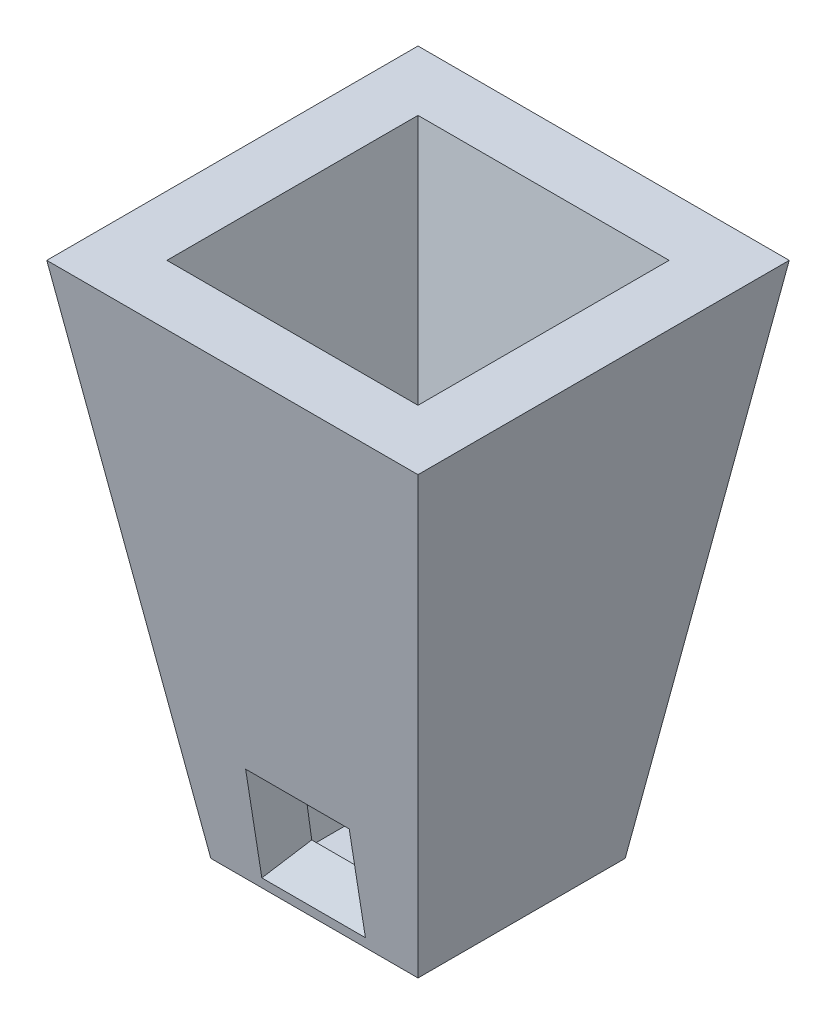
ISO-10303-21;
HEADER;
FILE_DESCRIPTION(('STEP AP214'),'2;1');
FILE_NAME('part.step','',(''),(''),'','','');
FILE_SCHEMA(('AUTOMOTIVE_DESIGN { 1 0 10303 214 1 1 1 1 }'));
ENDSEC;
DATA;
#1=APPLICATION_CONTEXT('core data for automotive mechanical design processes');
#2=APPLICATION_PROTOCOL_DEFINITION('international standard','automotive_design',2000,#1);
#3=PRODUCT_CONTEXT('',#1,'mechanical');
#4=PRODUCT('Part','Part','',(#3));
#5=PRODUCT_RELATED_PRODUCT_CATEGORY('part','',(#4));
#6=PRODUCT_DEFINITION_FORMATION('','',#4);
#7=PRODUCT_DEFINITION_CONTEXT('part definition',#1,'design');
#8=PRODUCT_DEFINITION('design','',#6,#7);
#9=PRODUCT_DEFINITION_SHAPE('','',#8);
#10=(LENGTH_UNIT() NAMED_UNIT(*) SI_UNIT(.MILLI.,.METRE.));
#11=(NAMED_UNIT(*) PLANE_ANGLE_UNIT() SI_UNIT($,.RADIAN.));
#12=(NAMED_UNIT(*) SI_UNIT($,.STERADIAN.) SOLID_ANGLE_UNIT());
#13=UNCERTAINTY_MEASURE_WITH_UNIT(LENGTH_MEASURE(1.E-05),#10,'distance_accuracy_value','');
#14=(GEOMETRIC_REPRESENTATION_CONTEXT(3) GLOBAL_UNCERTAINTY_ASSIGNED_CONTEXT((#13)) GLOBAL_UNIT_ASSIGNED_CONTEXT((#10,
#11,#12)) REPRESENTATION_CONTEXT('',''));
#15=CARTESIAN_POINT('',(0.,0.,0.));
#16=DIRECTION('',(0.,0.,1.));
#17=DIRECTION('',(1.,0.,0.));
#18=AXIS2_PLACEMENT_3D('',#15,#16,#17);
#19=CARTESIAN_POINT('',(-43.5142255154078,0.,-7.62404381991147));
#20=DIRECTION('',(0.,-0.156434465040231,-0.987688340595138));
#21=DIRECTION('',(0.,0.987688340595138,-0.156434465040231));
#22=AXIS2_PLACEMENT_3D('',#19,#20,#21);
#23=PLANE('',#22);
#24=DIRECTION('',(1.,0.,0.));
#25=VECTOR('',#24,1.);
#26=CARTESIAN_POINT('',(-43.5142255154078,0.,-7.62404381991147));
#27=LINE('',#26,#25);
#28=CARTESIAN_POINT('',(-43.5142255154078,0.,-7.62404381991147));
#29=VERTEX_POINT('',#28);
#30=CARTESIAN_POINT('',(7.28577448459214,0.,-7.62404381991147));
#31=VERTEX_POINT('',#30);
#32=EDGE_CURVE('E284',#29,#31,#27,.T.);
#33=ORIENTED_EDGE('',*,*,#32,.F.);
#34=DIRECTION('',(-0.154554782932108,0.975820494837866,-0.154554782932108));
#35=VECTOR('',#34,1.);
#36=CARTESIAN_POINT('',(-43.5142255154078,0.,-7.62404381991147));
#37=LINE('',#36,#35);
#38=CARTESIAN_POINT('',(-63.629049436624,127.,-27.7388677411276));
#39=VERTEX_POINT('',#38);
#40=EDGE_CURVE('E296',#39,#29,#37,.F.);
#41=ORIENTED_EDGE('',*,*,#40,.F.);
#42=DIRECTION('',(1.,0.,0.));
#43=VECTOR('',#42,1.);
#44=CARTESIAN_POINT('',(0.,127.,-27.7388677411276));
#45=LINE('',#44,#43);
#46=CARTESIAN_POINT('',(27.4005984058082,127.,-27.7388677411276));
#47=VERTEX_POINT('',#46);
#48=EDGE_CURVE('E306',#39,#47,#45,.T.);
#49=ORIENTED_EDGE('',*,*,#48,.T.);
#50=DIRECTION('',(-0.154554782932108,-0.975820494837866,0.154554782932108));
#51=VECTOR('',#50,1.);
#52=CARTESIAN_POINT('',(6.07230569349084,-7.6615404178267,-6.41057502881017));
#53=LINE('',#52,#51);
#54=EDGE_CURVE('E49',#47,#31,#53,.T.);
#55=ORIENTED_EDGE('',*,*,#54,.T.);
#56=EDGE_LOOP('',(#33,#41,#49,#55));
#57=FACE_BOUND('',#56,.T.);
#58=DIRECTION('',(-1.,0.,0.));
#59=VECTOR('',#58,1.);
#60=CARTESIAN_POINT('',(-5.61940159419177,27.5960122362282,-11.9948227731355));
#61=LINE('',#60,#59);
#62=CARTESIAN_POINT('',(-5.61940159419177,27.5960122362282,-11.9948227731355));
#63=VERTEX_POINT('',#62);
#64=CARTESIAN_POINT('',(-31.0194015941918,27.5960122362282,-11.9948227731355));
#65=VERTEX_POINT('',#64);
#66=EDGE_CURVE('E173',#63,#65,#61,.T.);
#67=ORIENTED_EDGE('',*,*,#66,.T.);
#68=DIRECTION('',(0.,-0.987688340595138,0.156434465040231));
#69=VECTOR('',#68,1.);
#70=CARTESIAN_POINT('',(-31.0194015941918,27.5960122362282,-11.9948227731355));
#71=LINE('',#70,#69);
#72=CARTESIAN_POINT('',(-31.0194015941918,2.50872838511165,-8.02138736111366));
#73=VERTEX_POINT('',#72);
#74=EDGE_CURVE('E156',#65,#73,#71,.T.);
#75=ORIENTED_EDGE('',*,*,#74,.T.);
#76=DIRECTION('',(-1.,0.,0.));
#77=VECTOR('',#76,1.);
#78=CARTESIAN_POINT('',(-5.61940159419177,2.50872838511165,-8.02138736111366));
#79=LINE('',#78,#77);
#80=CARTESIAN_POINT('',(-5.61940159419177,2.50872838511165,-8.02138736111366));
#81=VERTEX_POINT('',#80);
#82=EDGE_CURVE('E165',#81,#73,#79,.T.);
#83=ORIENTED_EDGE('',*,*,#82,.F.);
#84=DIRECTION('',(0.,-0.987688340595138,0.156434465040231));
#85=VECTOR('',#84,1.);
#86=CARTESIAN_POINT('',(-5.61940159419177,27.5960122362282,-11.9948227731355));
#87=LINE('',#86,#85);
#88=EDGE_CURVE('E57',#63,#81,#87,.T.);
#89=ORIENTED_EDGE('',*,*,#88,.F.);
#90=EDGE_LOOP('',(#67,#75,#83,#89));
#91=FACE_BOUND('',#90,.T.);
#92=ADVANCED_FACE('F39',(#57,#91),#23,.T.);
#93=CARTESIAN_POINT('',(-48.897049436624,127.,-13.0068677411276));
#94=DIRECTION('',(0.,-0.139173100960065,-0.99026806874157));
#95=DIRECTION('',(0.,0.99026806874157,-0.139173100960065));
#96=AXIS2_PLACEMENT_3D('',#93,#94,#95);
#97=PLANE('',#96);
#98=DIRECTION('',(1.,0.,0.));
#99=VECTOR('',#98,1.);
#100=CARTESIAN_POINT('',(-48.897049436624,127.,-13.0068677411276));
#101=LINE('',#100,#99);
#102=CARTESIAN_POINT('',(-48.897049436624,127.,-13.0068677411276));
#103=VERTEX_POINT('',#102);
#104=CARTESIAN_POINT('',(12.6685984058082,127.,-13.0068677411276));
#105=VERTEX_POINT('',#104);
#106=EDGE_CURVE('E241',#103,#105,#101,.T.);
#107=ORIENTED_EDGE('',*,*,#106,.F.);
#108=DIRECTION('',(0.137844537491629,-0.980814848463989,0.137844537491629));
#109=VECTOR('',#108,1.);
#110=CARTESIAN_POINT('',(-48.897049436624,127.,-13.0068677411276));
#111=LINE('',#110,#109);
#112=CARTESIAN_POINT('',(-31.4053371495643,2.54,4.48484454593206));
#113=VERTEX_POINT('',#112);
#114=EDGE_CURVE('E254',#113,#103,#111,.F.);
#115=ORIENTED_EDGE('',*,*,#114,.F.);
#116=DIRECTION('',(-1.,0.,0.));
#117=VECTOR('',#116,1.);
#118=CARTESIAN_POINT('',(-48.897049436624,2.53999999999999,4.48484454593206));
#119=LINE('',#118,#117);
#120=CARTESIAN_POINT('',(-4.82311388125139,2.54,4.48484454593206));
#121=VERTEX_POINT('',#120);
#122=EDGE_CURVE('E272',#113,#121,#119,.F.);
#123=ORIENTED_EDGE('',*,*,#122,.T.);
#124=DIRECTION('',(0.137844537491629,0.980814848463989,-0.137844537491629));
#125=VECTOR('',#124,1.);
#126=CARTESIAN_POINT('',(12.6685984058082,127.,-13.0068677411276));
#127=LINE('',#126,#125);
#128=EDGE_CURVE('E259',#121,#105,#127,.T.);
#129=ORIENTED_EDGE('',*,*,#128,.T.);
#130=EDGE_LOOP('',(#107,#115,#123,#129));
#131=FACE_BOUND('',#130,.T.);
#132=DIRECTION('',(1.,0.,0.));
#133=VECTOR('',#132,1.);
#134=CARTESIAN_POINT('',(-5.61940159419177,4.44707052530171,4.21682326246982));
#135=LINE('',#134,#133);
#136=CARTESIAN_POINT('',(-5.61940159419177,4.44707052530171,4.21682326246984));
#137=VERTEX_POINT('',#136);
#138=CARTESIAN_POINT('',(-31.0194015941918,4.4470705253017,4.21682326246983));
#139=VERTEX_POINT('',#138);
#140=EDGE_CURVE('E170',#137,#139,#135,.F.);
#141=ORIENTED_EDGE('',*,*,#140,.T.);
#142=DIRECTION('',(0.,0.99026806874157,-0.139173100960065));
#143=VECTOR('',#142,1.);
#144=CARTESIAN_POINT('',(-31.0194015941918,30.9357806710319,0.494077828399206));
#145=LINE('',#144,#143);
#146=CARTESIAN_POINT('',(-31.0194015941918,29.6037109495231,0.681288018941843));
#147=VERTEX_POINT('',#146);
#148=EDGE_CURVE('E65',#147,#139,#145,.F.);
#149=ORIENTED_EDGE('',*,*,#148,.F.);
#150=DIRECTION('',(1.,0.,0.));
#151=VECTOR('',#150,1.);
#152=CARTESIAN_POINT('',(-5.61940159419177,29.6037109495231,0.681288018941836));
#153=LINE('',#152,#151);
#154=CARTESIAN_POINT('',(-5.61940159419177,29.6037109495231,0.681288018941809));
#155=VERTEX_POINT('',#154);
#156=EDGE_CURVE('E425',#155,#147,#153,.F.);
#157=ORIENTED_EDGE('',*,*,#156,.F.);
#158=DIRECTION('',(0.,0.99026806874157,-0.139173100960065));
#159=VECTOR('',#158,1.);
#160=CARTESIAN_POINT('',(-5.61940159419177,30.9357806710319,0.494077828399206));
#161=LINE('',#160,#159);
#162=EDGE_CURVE('E422',#155,#137,#161,.F.);
#163=ORIENTED_EDGE('',*,*,#162,.T.);
#164=EDGE_LOOP('',(#141,#149,#157,#163));
#165=FACE_BOUND('',#164,.T.);
#166=ADVANCED_FACE('F344',(#131,#165),#97,.F.);
#167=CARTESIAN_POINT('',(-43.5142255154078,0.,43.1759561800885));
#168=DIRECTION('',(0.,-0.156434465040231,0.987688340595138));
#169=DIRECTION('',(0.,-0.987688340595138,-0.156434465040231));
#170=AXIS2_PLACEMENT_3D('',#167,#168,#169);
#171=PLANE('',#170);
#172=DIRECTION('',(1.,0.,0.));
#173=VECTOR('',#172,1.);
#174=CARTESIAN_POINT('',(-30.6090494366239,2.50872838511165,43.5732997212907));
#175=LINE('',#174,#173);
#176=CARTESIAN_POINT('',(-30.6090494366239,2.50872838511165,43.5732997212907));
#177=VERTEX_POINT('',#176);
#178=CARTESIAN_POINT('',(-5.20904943662394,2.50872838511165,43.5732997212907));
#179=VERTEX_POINT('',#178);
#180=EDGE_CURVE('E205',#177,#179,#175,.T.);
#181=ORIENTED_EDGE('',*,*,#180,.F.);
#182=DIRECTION('',(0.,-0.987688340595138,-0.156434465040231));
#183=VECTOR('',#182,1.);
#184=CARTESIAN_POINT('',(-30.6090494366239,27.5960122362282,47.5467351333126));
#185=LINE('',#184,#183);
#186=CARTESIAN_POINT('',(-30.6090494366239,27.5960122362282,47.5467351333126));
#187=VERTEX_POINT('',#186);
#188=EDGE_CURVE('E202',#187,#177,#185,.T.);
#189=ORIENTED_EDGE('',*,*,#188,.F.);
#190=DIRECTION('',(-1.,0.,0.));
#191=VECTOR('',#190,1.);
#192=CARTESIAN_POINT('',(-30.6090494366239,27.5960122362282,47.5467351333126));
#193=LINE('',#192,#191);
#194=CARTESIAN_POINT('',(-5.20904943662394,27.5960122362281,47.5467351333126));
#195=VERTEX_POINT('',#194);
#196=EDGE_CURVE('E213',#195,#187,#193,.T.);
#197=ORIENTED_EDGE('',*,*,#196,.F.);
#198=DIRECTION('',(0.,0.987688340595138,0.156434465040231));
#199=VECTOR('',#198,1.);
#200=CARTESIAN_POINT('',(-5.20904943662394,27.5960122362281,47.5467351333126));
#201=LINE('',#200,#199);
#202=EDGE_CURVE('E209',#179,#195,#201,.T.);
#203=ORIENTED_EDGE('',*,*,#202,.F.);
#204=EDGE_LOOP('',(#181,#189,#197,#203));
#205=FACE_BOUND('',#204,.T.);
#206=DIRECTION('',(1.,0.,0.));
#207=VECTOR('',#206,1.);
#208=CARTESIAN_POINT('',(-43.5142255154078,0.,43.1759561800885));
#209=LINE('',#208,#207);
#210=CARTESIAN_POINT('',(-43.5142255154078,0.,43.1759561800885));
#211=VERTEX_POINT('',#210);
#212=CARTESIAN_POINT('',(7.28577448459215,0.,43.1759561800885));
#213=VERTEX_POINT('',#212);
#214=EDGE_CURVE('E253',#211,#213,#209,.T.);
#215=ORIENTED_EDGE('',*,*,#214,.T.);
#216=DIRECTION('',(0.154554782932108,0.975820494837866,0.154554782932108));
#217=VECTOR('',#216,1.);
#218=CARTESIAN_POINT('',(6.07230569349086,-7.66154041782671,41.9624873889872));
#219=LINE('',#218,#217);
#220=CARTESIAN_POINT('',(27.4005984058083,127.,63.2907801013046));
#221=VERTEX_POINT('',#220);
#222=EDGE_CURVE('E11',#221,#213,#219,.F.);
#223=ORIENTED_EDGE('',*,*,#222,.F.);
#224=DIRECTION('',(-1.,0.,0.));
#225=VECTOR('',#224,1.);
#226=CARTESIAN_POINT('',(0.,127.,63.2907801013046));
#227=LINE('',#226,#225);
#228=CARTESIAN_POINT('',(-63.629049436624,127.,63.2907801013046));
#229=VERTEX_POINT('',#228);
#230=EDGE_CURVE('E290',#229,#221,#227,.F.);
#231=ORIENTED_EDGE('',*,*,#230,.F.);
#232=DIRECTION('',(0.154554782932108,-0.975820494837866,-0.154554782932108));
#233=VECTOR('',#232,1.);
#234=CARTESIAN_POINT('',(-43.5142255154078,0.,43.1759561800885));
#235=LINE('',#234,#233);
#236=EDGE_CURVE('E292',#229,#211,#235,.T.);
#237=ORIENTED_EDGE('',*,*,#236,.T.);
#238=EDGE_LOOP('',(#215,#223,#231,#237));
#239=FACE_BOUND('',#238,.T.);
#240=ADVANCED_FACE('F324',(#205,#239),#171,.T.);
#241=CARTESIAN_POINT('',(7.28577448459214,0.,-7.62404381991147));
#242=DIRECTION('',(0.987688340595138,-0.156434465040231,0.));
#243=DIRECTION('',(0.156434465040231,0.987688340595138,0.));
#244=AXIS2_PLACEMENT_3D('',#241,#242,#243);
#245=PLANE('',#244);
#246=DIRECTION('',(0.,0.,1.));
#247=VECTOR('',#246,1.);
#248=CARTESIAN_POINT('',(7.28577448459214,0.,-7.62404381991147));
#249=LINE('',#248,#247);
#250=EDGE_CURVE('E280',#31,#213,#249,.T.);
#251=ORIENTED_EDGE('',*,*,#250,.F.);
#252=ORIENTED_EDGE('',*,*,#54,.F.);
#253=DIRECTION('',(0.,0.,1.));
#254=VECTOR('',#253,1.);
#255=CARTESIAN_POINT('',(27.4005984058083,127.,0.));
#256=LINE('',#255,#254);
#257=EDGE_CURVE('E303',#47,#221,#256,.T.);
#258=ORIENTED_EDGE('',*,*,#257,.T.);
#259=ORIENTED_EDGE('',*,*,#222,.T.);
#260=EDGE_LOOP('',(#251,#252,#258,#259));
#261=FACE_BOUND('',#260,.T.);
#262=ADVANCED_FACE('F41',(#261),#245,.T.);
#263=CARTESIAN_POINT('',(-43.5142255154078,0.,-7.62404381991147));
#264=DIRECTION('',(-0.987688340595138,-0.156434465040231,0.));
#265=DIRECTION('',(0.156434465040231,-0.987688340595138,0.));
#266=AXIS2_PLACEMENT_3D('',#263,#264,#265);
#267=PLANE('',#266);
#268=DIRECTION('',(0.,0.,1.));
#269=VECTOR('',#268,1.);
#270=CARTESIAN_POINT('',(-43.5142255154078,0.,-7.62404381991147));
#271=LINE('',#270,#269);
#272=EDGE_CURVE('E288',#29,#211,#271,.T.);
#273=ORIENTED_EDGE('',*,*,#272,.T.);
#274=ORIENTED_EDGE('',*,*,#236,.F.);
#275=DIRECTION('',(0.,0.,-1.));
#276=VECTOR('',#275,1.);
#277=CARTESIAN_POINT('',(-63.629049436624,127.,0.));
#278=LINE('',#277,#276);
#279=EDGE_CURVE('E43',#39,#229,#278,.F.);
#280=ORIENTED_EDGE('',*,*,#279,.F.);
#281=ORIENTED_EDGE('',*,*,#40,.T.);
#282=EDGE_LOOP('',(#273,#274,#280,#281));
#283=FACE_BOUND('',#282,.T.);
#284=ADVANCED_FACE('F320',(#283),#267,.T.);
#285=CARTESIAN_POINT('',(0.,127.,0.));
#286=DIRECTION('',(0.,-1.,0.));
#287=DIRECTION('',(0.,0.,-1.));
#288=AXIS2_PLACEMENT_3D('',#285,#286,#287);
#289=PLANE('',#288);
#290=DIRECTION('',(0.,0.,1.));
#291=VECTOR('',#290,1.);
#292=CARTESIAN_POINT('',(12.6685984058082,127.,-13.0068677411276));
#293=LINE('',#292,#291);
#294=CARTESIAN_POINT('',(12.6685984058083,127.,48.5587801013046));
#295=VERTEX_POINT('',#294);
#296=EDGE_CURVE('E237',#105,#295,#293,.T.);
#297=ORIENTED_EDGE('',*,*,#296,.T.);
#298=DIRECTION('',(1.,0.,0.));
#299=VECTOR('',#298,1.);
#300=CARTESIAN_POINT('',(-48.897049436624,127.,48.5587801013046));
#301=LINE('',#300,#299);
#302=CARTESIAN_POINT('',(-48.897049436624,127.,48.5587801013046));
#303=VERTEX_POINT('',#302);
#304=EDGE_CURVE('E234',#303,#295,#301,.T.);
#305=ORIENTED_EDGE('',*,*,#304,.F.);
#306=DIRECTION('',(0.,0.,1.));
#307=VECTOR('',#306,1.);
#308=CARTESIAN_POINT('',(-48.897049436624,127.,-13.0068677411276));
#309=LINE('',#308,#307);
#310=EDGE_CURVE('E245',#103,#303,#309,.T.);
#311=ORIENTED_EDGE('',*,*,#310,.F.);
#312=ORIENTED_EDGE('',*,*,#106,.T.);
#313=EDGE_LOOP('',(#297,#305,#311,#312));
#314=FACE_BOUND('',#313,.T.);
#315=ORIENTED_EDGE('',*,*,#230,.T.);
#316=ORIENTED_EDGE('',*,*,#257,.F.);
#317=ORIENTED_EDGE('',*,*,#48,.F.);
#318=ORIENTED_EDGE('',*,*,#279,.T.);
#319=EDGE_LOOP('',(#315,#316,#317,#318));
#320=FACE_BOUND('',#319,.T.);
#321=ADVANCED_FACE('F315',(#314,#320),#289,.F.);
#322=CARTESIAN_POINT('',(0.,0.,0.));
#323=DIRECTION('',(0.,-1.,0.));
#324=DIRECTION('',(0.,0.,-1.));
#325=AXIS2_PLACEMENT_3D('',#322,#323,#324);
#326=PLANE('',#325);
#327=ORIENTED_EDGE('',*,*,#214,.F.);
#328=ORIENTED_EDGE('',*,*,#272,.F.);
#329=ORIENTED_EDGE('',*,*,#32,.T.);
#330=ORIENTED_EDGE('',*,*,#250,.T.);
#331=EDGE_LOOP('',(#327,#328,#329,#330));
#332=FACE_BOUND('',#331,.T.);
#333=ADVANCED_FACE('F329',(#332),#326,.T.);
#334=CARTESIAN_POINT('',(-48.897049436624,127.,48.5587801013046));
#335=DIRECTION('',(0.,-0.139173100960065,0.99026806874157));
#336=DIRECTION('',(0.,-0.99026806874157,-0.139173100960065));
#337=AXIS2_PLACEMENT_3D('',#334,#335,#336);
#338=PLANE('',#337);
#339=DIRECTION('',(1.,0.,0.));
#340=VECTOR('',#339,1.);
#341=CARTESIAN_POINT('',(-30.6090494366239,29.6037109495231,34.8706243412352));
#342=LINE('',#341,#340);
#343=CARTESIAN_POINT('',(-30.6090494366239,29.6037109495231,34.8706243412352));
#344=VERTEX_POINT('',#343);
#345=CARTESIAN_POINT('',(-5.20904943662394,29.6037109495231,34.8706243412352));
#346=VERTEX_POINT('',#345);
#347=EDGE_CURVE('E194',#344,#346,#342,.T.);
#348=ORIENTED_EDGE('',*,*,#347,.F.);
#349=DIRECTION('',(0.,0.99026806874157,0.139173100960065));
#350=VECTOR('',#349,1.);
#351=CARTESIAN_POINT('',(-30.6090494366239,30.9357806710319,35.0578345317779));
#352=LINE('',#351,#350);
#353=CARTESIAN_POINT('',(-30.6090494366239,4.44707052530171,31.3350890977072));
#354=VERTEX_POINT('',#353);
#355=EDGE_CURVE('E198',#354,#344,#352,.T.);
#356=ORIENTED_EDGE('',*,*,#355,.F.);
#357=DIRECTION('',(-1.,0.,0.));
#358=VECTOR('',#357,1.);
#359=CARTESIAN_POINT('',(-30.6090494366239,4.44707052530171,31.3350890977072));
#360=LINE('',#359,#358);
#361=CARTESIAN_POINT('',(-5.20904943662394,4.44707052530171,31.3350890977072));
#362=VERTEX_POINT('',#361);
#363=EDGE_CURVE('E221',#362,#354,#360,.T.);
#364=ORIENTED_EDGE('',*,*,#363,.F.);
#365=DIRECTION('',(0.,-0.99026806874157,-0.139173100960065));
#366=VECTOR('',#365,1.);
#367=CARTESIAN_POINT('',(-5.20904943662394,30.9357806710319,35.0578345317779));
#368=LINE('',#367,#366);
#369=EDGE_CURVE('E191',#346,#362,#368,.T.);
#370=ORIENTED_EDGE('',*,*,#369,.F.);
#371=EDGE_LOOP('',(#348,#356,#364,#370));
#372=FACE_BOUND('',#371,.T.);
#373=ORIENTED_EDGE('',*,*,#304,.T.);
#374=DIRECTION('',(-0.137844537491629,-0.980814848463989,-0.137844537491629));
#375=VECTOR('',#374,1.);
#376=CARTESIAN_POINT('',(11.4987823577539,118.676326310915,47.3889640532503));
#377=LINE('',#376,#375);
#378=CARTESIAN_POINT('',(-4.82311388125139,2.54,31.067067814245));
#379=VERTEX_POINT('',#378);
#380=EDGE_CURVE('E255',#379,#295,#377,.F.);
#381=ORIENTED_EDGE('',*,*,#380,.F.);
#382=DIRECTION('',(1.,0.,0.));
#383=VECTOR('',#382,1.);
#384=CARTESIAN_POINT('',(-48.897049436624,2.53999999999999,31.067067814245));
#385=LINE('',#384,#383);
#386=CARTESIAN_POINT('',(-31.4053371495643,2.54,31.067067814245));
#387=VERTEX_POINT('',#386);
#388=EDGE_CURVE('E249',#387,#379,#385,.T.);
#389=ORIENTED_EDGE('',*,*,#388,.F.);
#390=DIRECTION('',(-0.137844537491629,0.980814848463989,0.137844537491629));
#391=VECTOR('',#390,1.);
#392=CARTESIAN_POINT('',(-47.7272333885696,118.676326310915,47.3889640532503));
#393=LINE('',#392,#391);
#394=EDGE_CURVE('E250',#387,#303,#393,.T.);
#395=ORIENTED_EDGE('',*,*,#394,.T.);
#396=EDGE_LOOP('',(#373,#381,#389,#395));
#397=FACE_BOUND('',#396,.T.);
#398=ADVANCED_FACE('F331',(#372,#397),#338,.F.);
#399=CARTESIAN_POINT('',(-48.897049436624,127.,-13.0068677411276));
#400=DIRECTION('',(-0.99026806874157,-0.139173100960065,0.));
#401=DIRECTION('',(0.139173100960065,-0.99026806874157,0.));
#402=AXIS2_PLACEMENT_3D('',#399,#400,#401);
#403=PLANE('',#402);
#404=ORIENTED_EDGE('',*,*,#310,.T.);
#405=ORIENTED_EDGE('',*,*,#394,.F.);
#406=DIRECTION('',(0.,0.,1.));
#407=VECTOR('',#406,1.);
#408=CARTESIAN_POINT('',(-31.4053371495643,2.53999999999999,-13.0068677411276));
#409=LINE('',#408,#407);
#410=EDGE_CURVE('E260',#113,#387,#409,.T.);
#411=ORIENTED_EDGE('',*,*,#410,.F.);
#412=ORIENTED_EDGE('',*,*,#114,.T.);
#413=EDGE_LOOP('',(#404,#405,#411,#412));
#414=FACE_BOUND('',#413,.T.);
#415=ADVANCED_FACE('F337',(#414),#403,.F.);
#416=CARTESIAN_POINT('',(12.6685984058082,127.,-13.0068677411276));
#417=DIRECTION('',(0.99026806874157,-0.139173100960065,0.));
#418=DIRECTION('',(0.139173100960065,0.99026806874157,0.));
#419=AXIS2_PLACEMENT_3D('',#416,#417,#418);
#420=PLANE('',#419);
#421=ORIENTED_EDGE('',*,*,#296,.F.);
#422=ORIENTED_EDGE('',*,*,#128,.F.);
#423=DIRECTION('',(0.,0.,-1.));
#424=VECTOR('',#423,1.);
#425=CARTESIAN_POINT('',(-4.8231138812514,2.53999999999999,-13.0068677411276));
#426=LINE('',#425,#424);
#427=EDGE_CURVE('E268',#121,#379,#426,.F.);
#428=ORIENTED_EDGE('',*,*,#427,.T.);
#429=ORIENTED_EDGE('',*,*,#380,.T.);
#430=EDGE_LOOP('',(#421,#422,#428,#429));
#431=FACE_BOUND('',#430,.T.);
#432=ADVANCED_FACE('F381',(#431),#420,.F.);
#433=CARTESIAN_POINT('',(0.,2.54,0.));
#434=DIRECTION('',(0.,-1.,0.));
#435=DIRECTION('',(0.,0.,-1.));
#436=AXIS2_PLACEMENT_3D('',#433,#434,#435);
#437=PLANE('',#436);
#438=ORIENTED_EDGE('',*,*,#388,.T.);
#439=ORIENTED_EDGE('',*,*,#427,.F.);
#440=ORIENTED_EDGE('',*,*,#122,.F.);
#441=ORIENTED_EDGE('',*,*,#410,.T.);
#442=EDGE_LOOP('',(#438,#439,#440,#441));
#443=FACE_BOUND('',#442,.T.);
#444=ADVANCED_FACE('F388',(#443),#437,.F.);
#445=CARTESIAN_POINT('',(-30.6090494366239,41.6610453041064,-41.256388702958));
#446=DIRECTION('',(-1.,0.,0.));
#447=DIRECTION('',(0.,-1.,0.));
#448=AXIS2_PLACEMENT_3D('',#445,#446,#447);
#449=PLANE('',#448);
#450=ORIENTED_EDGE('',*,*,#355,.T.);
#451=DIRECTION('',(0.,-0.156434465040231,0.987688340595138));
#452=VECTOR('',#451,1.);
#453=CARTESIAN_POINT('',(-30.6090494366239,41.6610453041064,-41.256388702958));
#454=LINE('',#453,#452);
#455=EDGE_CURVE('E218',#344,#187,#454,.T.);
#456=ORIENTED_EDGE('',*,*,#455,.T.);
#457=ORIENTED_EDGE('',*,*,#188,.T.);
#458=DIRECTION('',(0.,-0.156434465040231,0.987688340595138));
#459=VECTOR('',#458,1.);
#460=CARTESIAN_POINT('',(-30.6090494366239,16.5737614529899,-45.2298241149799));
#461=LINE('',#460,#459);
#462=EDGE_CURVE('E217',#354,#177,#461,.T.);
#463=ORIENTED_EDGE('',*,*,#462,.F.);
#464=EDGE_LOOP('',(#450,#456,#457,#463));
#465=FACE_BOUND('',#464,.T.);
#466=ADVANCED_FACE('F367',(#465),#449,.F.);
#467=CARTESIAN_POINT('',(-30.6090494366239,41.6610453041064,-41.256388702958));
#468=DIRECTION('',(0.,0.987688340595138,0.156434465040231));
#469=DIRECTION('',(0.,-0.156434465040231,0.987688340595138));
#470=AXIS2_PLACEMENT_3D('',#467,#468,#469);
#471=PLANE('',#470);
#472=ORIENTED_EDGE('',*,*,#347,.T.);
#473=DIRECTION('',(0.,-0.156434465040231,0.987688340595138));
#474=VECTOR('',#473,1.);
#475=CARTESIAN_POINT('',(-5.20904943662394,41.6610453041064,-41.256388702958));
#476=LINE('',#475,#474);
#477=EDGE_CURVE('E222',#346,#195,#476,.T.);
#478=ORIENTED_EDGE('',*,*,#477,.T.);
#479=ORIENTED_EDGE('',*,*,#196,.T.);
#480=ORIENTED_EDGE('',*,*,#455,.F.);
#481=EDGE_LOOP('',(#472,#478,#479,#480));
#482=FACE_BOUND('',#481,.T.);
#483=ADVANCED_FACE('F370',(#482),#471,.F.);
#484=CARTESIAN_POINT('',(-5.20904943662394,41.6610453041064,-41.256388702958));
#485=DIRECTION('',(1.,0.,0.));
#486=DIRECTION('',(0.,1.,0.));
#487=AXIS2_PLACEMENT_3D('',#484,#485,#486);
#488=PLANE('',#487);
#489=ORIENTED_EDGE('',*,*,#369,.T.);
#490=DIRECTION('',(0.,-0.156434465040231,0.987688340595138));
#491=VECTOR('',#490,1.);
#492=CARTESIAN_POINT('',(-5.20904943662394,16.5737614529899,-45.2298241149799));
#493=LINE('',#492,#491);
#494=EDGE_CURVE('E225',#362,#179,#493,.T.);
#495=ORIENTED_EDGE('',*,*,#494,.T.);
#496=ORIENTED_EDGE('',*,*,#202,.T.);
#497=ORIENTED_EDGE('',*,*,#477,.F.);
#498=EDGE_LOOP('',(#489,#495,#496,#497));
#499=FACE_BOUND('',#498,.T.);
#500=ADVANCED_FACE('F373',(#499),#488,.F.);
#501=CARTESIAN_POINT('',(-30.6090494366239,16.5737614529899,-45.2298241149799));
#502=DIRECTION('',(0.,-0.987688340595138,-0.156434465040231));
#503=DIRECTION('',(0.,0.156434465040231,-0.987688340595138));
#504=AXIS2_PLACEMENT_3D('',#501,#502,#503);
#505=PLANE('',#504);
#506=ORIENTED_EDGE('',*,*,#363,.T.);
#507=ORIENTED_EDGE('',*,*,#462,.T.);
#508=ORIENTED_EDGE('',*,*,#180,.T.);
#509=ORIENTED_EDGE('',*,*,#494,.F.);
#510=EDGE_LOOP('',(#506,#507,#508,#509));
#511=FACE_BOUND('',#510,.T.);
#512=ADVANCED_FACE('F363',(#511),#505,.F.);
#513=CARTESIAN_POINT('',(-31.0194015941918,41.6610453041064,76.8083010631351));
#514=DIRECTION('',(1.,0.,0.));
#515=DIRECTION('',(0.,1.,0.));
#516=AXIS2_PLACEMENT_3D('',#513,#514,#515);
#517=PLANE('',#516);
#518=ORIENTED_EDGE('',*,*,#148,.T.);
#519=DIRECTION('',(0.,-0.156434465040231,-0.987688340595138));
#520=VECTOR('',#519,1.);
#521=CARTESIAN_POINT('',(-31.0194015941918,16.5737614529899,80.7817364751569));
#522=LINE('',#521,#520);
#523=EDGE_CURVE('E152',#139,#73,#522,.T.);
#524=ORIENTED_EDGE('',*,*,#523,.T.);
#525=ORIENTED_EDGE('',*,*,#74,.F.);
#526=DIRECTION('',(0.,-0.156434465040231,-0.987688340595138));
#527=VECTOR('',#526,1.);
#528=CARTESIAN_POINT('',(-31.0194015941918,41.6610453041064,76.8083010631351));
#529=LINE('',#528,#527);
#530=EDGE_CURVE('E162',#147,#65,#529,.T.);
#531=ORIENTED_EDGE('',*,*,#530,.F.);
#532=EDGE_LOOP('',(#518,#524,#525,#531));
#533=FACE_BOUND('',#532,.T.);
#534=ADVANCED_FACE('F154',(#533),#517,.T.);
#535=CARTESIAN_POINT('',(-5.61940159419177,41.6610453041064,76.8083010631351));
#536=DIRECTION('',(0.,-0.987688340595138,0.156434465040231));
#537=DIRECTION('',(0.,-0.156434465040231,-0.987688340595138));
#538=AXIS2_PLACEMENT_3D('',#535,#536,#537);
#539=PLANE('',#538);
#540=ORIENTED_EDGE('',*,*,#156,.T.);
#541=ORIENTED_EDGE('',*,*,#530,.T.);
#542=ORIENTED_EDGE('',*,*,#66,.F.);
#543=DIRECTION('',(0.,-0.156434465040231,-0.987688340595138));
#544=VECTOR('',#543,1.);
#545=CARTESIAN_POINT('',(-5.61940159419177,41.6610453041064,76.8083010631351));
#546=LINE('',#545,#544);
#547=EDGE_CURVE('E184',#155,#63,#546,.T.);
#548=ORIENTED_EDGE('',*,*,#547,.F.);
#549=EDGE_LOOP('',(#540,#541,#542,#548));
#550=FACE_BOUND('',#549,.T.);
#551=ADVANCED_FACE('F413',(#550),#539,.T.);
#552=CARTESIAN_POINT('',(-5.61940159419177,41.6610453041064,76.8083010631351));
#553=DIRECTION('',(1.,0.,0.));
#554=DIRECTION('',(0.,1.,0.));
#555=AXIS2_PLACEMENT_3D('',#552,#553,#554);
#556=PLANE('',#555);
#557=ORIENTED_EDGE('',*,*,#547,.T.);
#558=ORIENTED_EDGE('',*,*,#88,.T.);
#559=DIRECTION('',(0.,-0.156434465040231,-0.987688340595138));
#560=VECTOR('',#559,1.);
#561=CARTESIAN_POINT('',(-5.61940159419177,16.5737614529899,80.7817364751569));
#562=LINE('',#561,#560);
#563=EDGE_CURVE('E167',#137,#81,#562,.T.);
#564=ORIENTED_EDGE('',*,*,#563,.F.);
#565=ORIENTED_EDGE('',*,*,#162,.F.);
#566=EDGE_LOOP('',(#557,#558,#564,#565));
#567=FACE_BOUND('',#566,.T.);
#568=ADVANCED_FACE('F410',(#567),#556,.F.);
#569=CARTESIAN_POINT('',(-5.61940159419177,16.5737614529899,80.7817364751569));
#570=DIRECTION('',(0.,-0.987688340595138,0.156434465040231));
#571=DIRECTION('',(0.,-0.156434465040231,-0.987688340595138));
#572=AXIS2_PLACEMENT_3D('',#569,#570,#571);
#573=PLANE('',#572);
#574=ORIENTED_EDGE('',*,*,#563,.T.);
#575=ORIENTED_EDGE('',*,*,#82,.T.);
#576=ORIENTED_EDGE('',*,*,#523,.F.);
#577=ORIENTED_EDGE('',*,*,#140,.F.);
#578=EDGE_LOOP('',(#574,#575,#576,#577));
#579=FACE_BOUND('',#578,.T.);
#580=ADVANCED_FACE('F166',(#579),#573,.F.);
#581=CLOSED_SHELL('',(#92,#166,#240,#262,#284,#321,#333,#398,#415,#432,#444,#466,#483,#500,#512,
#534,#551,#568,#580));
#582=MANIFOLD_SOLID_BREP('B2',#581);
#583=ADVANCED_BREP_SHAPE_REPRESENTATION('',(#18,#582),#14);
#584=SHAPE_DEFINITION_REPRESENTATION(#9,#583);
ENDSEC;
END-ISO-10303-21;
